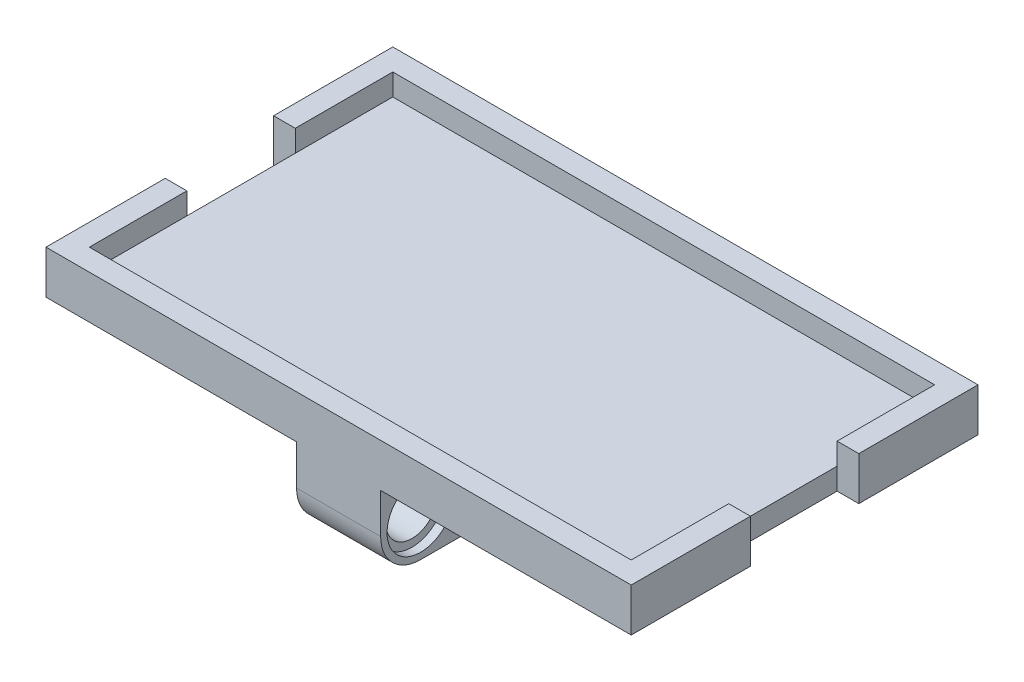
ISO-10303-21;
HEADER;
FILE_DESCRIPTION(('STEP AP214'),'2;1');
FILE_NAME('part.step','',(''),(''),'','','');
FILE_SCHEMA(('AUTOMOTIVE_DESIGN { 1 0 10303 214 1 1 1 1 }'));
ENDSEC;
DATA;
#1=APPLICATION_CONTEXT('core data for automotive mechanical design processes');
#2=APPLICATION_PROTOCOL_DEFINITION('international standard','automotive_design',2000,#1);
#3=PRODUCT_CONTEXT('',#1,'mechanical');
#4=PRODUCT('Part','Part','',(#3));
#5=PRODUCT_RELATED_PRODUCT_CATEGORY('part','',(#4));
#6=PRODUCT_DEFINITION_FORMATION('','',#4);
#7=PRODUCT_DEFINITION_CONTEXT('part definition',#1,'design');
#8=PRODUCT_DEFINITION('design','',#6,#7);
#9=PRODUCT_DEFINITION_SHAPE('','',#8);
#10=(LENGTH_UNIT() NAMED_UNIT(*) SI_UNIT(.MILLI.,.METRE.));
#11=(NAMED_UNIT(*) PLANE_ANGLE_UNIT() SI_UNIT($,.RADIAN.));
#12=(NAMED_UNIT(*) SI_UNIT($,.STERADIAN.) SOLID_ANGLE_UNIT());
#13=UNCERTAINTY_MEASURE_WITH_UNIT(LENGTH_MEASURE(1.E-05),#10,'distance_accuracy_value','');
#14=(GEOMETRIC_REPRESENTATION_CONTEXT(3) GLOBAL_UNCERTAINTY_ASSIGNED_CONTEXT((#13)) GLOBAL_UNIT_ASSIGNED_CONTEXT((#10,
#11,#12)) REPRESENTATION_CONTEXT('',''));
#15=CARTESIAN_POINT('',(0.,0.,0.));
#16=DIRECTION('',(0.,0.,1.));
#17=DIRECTION('',(1.,0.,0.));
#18=AXIS2_PLACEMENT_3D('',#15,#16,#17);
#19=CARTESIAN_POINT('',(23.09,-3.69,-19.63));
#20=DIRECTION('',(1.,0.,0.));
#21=DIRECTION('',(0.,0.,-1.));
#22=AXIS2_PLACEMENT_3D('',#19,#20,#21);
#23=CYLINDRICAL_SURFACE('',#22,2.4);
#24=CARTESIAN_POINT('',(23.92,-3.69,-19.63));
#25=DIRECTION('',(-1.,0.,0.));
#26=DIRECTION('',(0.,0.,1.));
#27=AXIS2_PLACEMENT_3D('',#24,#25,#26);
#28=CIRCLE('',#27,2.4);
#29=CARTESIAN_POINT('',(23.92,-3.69,-17.23));
#30=VERTEX_POINT('',#29);
#31=EDGE_CURVE('E219',#30,#30,#28,.F.);
#32=ORIENTED_EDGE('',*,*,#31,.F.);
#33=EDGE_LOOP('',(#32));
#34=FACE_BOUND('',#33,.T.);
#35=CARTESIAN_POINT('',(30.08,-3.69,-19.63));
#36=DIRECTION('',(1.,0.,0.));
#37=DIRECTION('',(0.,0.,-1.));
#38=AXIS2_PLACEMENT_3D('',#35,#36,#37);
#39=CIRCLE('',#38,2.4);
#40=CARTESIAN_POINT('',(30.08,-3.69,-22.03));
#41=VERTEX_POINT('',#40);
#42=EDGE_CURVE('E374',#41,#41,#39,.F.);
#43=ORIENTED_EDGE('',*,*,#42,.F.);
#44=EDGE_LOOP('',(#43));
#45=FACE_BOUND('',#44,.T.);
#46=ADVANCED_FACE('F35',(#34,#45),#23,.F.);
#47=CARTESIAN_POINT('',(23.09,-3.69,-11.66));
#48=DIRECTION('',(1.,0.,0.));
#49=DIRECTION('',(0.,0.,-1.));
#50=AXIS2_PLACEMENT_3D('',#47,#48,#49);
#51=CYLINDRICAL_SURFACE('',#50,2.4);
#52=CARTESIAN_POINT('',(23.92,-3.69,-11.66));
#53=DIRECTION('',(-1.,0.,0.));
#54=DIRECTION('',(0.,0.,1.));
#55=AXIS2_PLACEMENT_3D('',#52,#53,#54);
#56=CIRCLE('',#55,2.4);
#57=CARTESIAN_POINT('',(23.92,-3.69,-9.26));
#58=VERTEX_POINT('',#57);
#59=EDGE_CURVE('E361',#58,#58,#56,.F.);
#60=ORIENTED_EDGE('',*,*,#59,.F.);
#61=EDGE_LOOP('',(#60));
#62=FACE_BOUND('',#61,.T.);
#63=CARTESIAN_POINT('',(30.08,-3.69,-11.66));
#64=DIRECTION('',(1.,0.,0.));
#65=DIRECTION('',(0.,0.,-1.));
#66=AXIS2_PLACEMENT_3D('',#63,#64,#65);
#67=CIRCLE('',#66,2.4);
#68=CARTESIAN_POINT('',(30.08,-3.69,-14.06));
#69=VERTEX_POINT('',#68);
#70=EDGE_CURVE('E370',#69,#69,#67,.F.);
#71=ORIENTED_EDGE('',*,*,#70,.F.);
#72=EDGE_LOOP('',(#71));
#73=FACE_BOUND('',#72,.T.);
#74=ADVANCED_FACE('F413',(#62,#73),#51,.F.);
#75=CARTESIAN_POINT('',(23.09,-3.69,-3.69));
#76=DIRECTION('',(1.,0.,0.));
#77=DIRECTION('',(0.,0.,-1.));
#78=AXIS2_PLACEMENT_3D('',#75,#76,#77);
#79=CYLINDRICAL_SURFACE('',#78,2.4);
#80=CARTESIAN_POINT('',(23.92,-3.69,-3.69));
#81=DIRECTION('',(-1.,0.,0.));
#82=DIRECTION('',(0.,0.,1.));
#83=AXIS2_PLACEMENT_3D('',#80,#81,#82);
#84=CIRCLE('',#83,2.4);
#85=CARTESIAN_POINT('',(23.92,-3.69,-1.29));
#86=VERTEX_POINT('',#85);
#87=EDGE_CURVE('E358',#86,#86,#84,.F.);
#88=ORIENTED_EDGE('',*,*,#87,.F.);
#89=EDGE_LOOP('',(#88));
#90=FACE_BOUND('',#89,.T.);
#91=CARTESIAN_POINT('',(30.08,-3.69,-3.69));
#92=DIRECTION('',(1.,0.,0.));
#93=DIRECTION('',(0.,0.,-1.));
#94=AXIS2_PLACEMENT_3D('',#91,#92,#93);
#95=CIRCLE('',#94,2.4);
#96=CARTESIAN_POINT('',(30.08,-3.69,-6.09));
#97=VERTEX_POINT('',#96);
#98=EDGE_CURVE('E367',#97,#97,#95,.F.);
#99=ORIENTED_EDGE('',*,*,#98,.F.);
#100=EDGE_LOOP('',(#99));
#101=FACE_BOUND('',#100,.T.);
#102=ADVANCED_FACE('F420',(#90,#101),#79,.F.);
#103=CARTESIAN_POINT('',(0.,2.,0.));
#104=DIRECTION('',(1.,0.,0.));
#105=DIRECTION('',(0.,0.,-1.));
#106=AXIS2_PLACEMENT_3D('',#103,#104,#105);
#107=PLANE('',#106);
#108=DIRECTION('',(0.,0.,1.));
#109=VECTOR('',#108,1.);
#110=CARTESIAN_POINT('',(0.,0.,0.));
#111=LINE('',#110,#109);
#112=CARTESIAN_POINT('',(0.,0.,-32.));
#113=VERTEX_POINT('',#112);
#114=CARTESIAN_POINT('',(0.,0.,-21.));
#115=VERTEX_POINT('',#114);
#116=EDGE_CURVE('E333',#113,#115,#111,.T.);
#117=ORIENTED_EDGE('',*,*,#116,.T.);
#118=DIRECTION('',(0.,1.,0.));
#119=VECTOR('',#118,1.);
#120=CARTESIAN_POINT('',(0.,0.,-21.));
#121=LINE('',#120,#119);
#122=CARTESIAN_POINT('',(0.,4.,-21.));
#123=VERTEX_POINT('',#122);
#124=EDGE_CURVE('E244',#115,#123,#121,.T.);
#125=ORIENTED_EDGE('',*,*,#124,.T.);
#126=DIRECTION('',(0.,0.,1.));
#127=VECTOR('',#126,1.);
#128=CARTESIAN_POINT('',(0.,4.,0.));
#129=LINE('',#128,#127);
#130=CARTESIAN_POINT('',(0.,4.,-32.));
#131=VERTEX_POINT('',#130);
#132=EDGE_CURVE('E298',#131,#123,#129,.T.);
#133=ORIENTED_EDGE('',*,*,#132,.F.);
#134=DIRECTION('',(0.,-1.,0.));
#135=VECTOR('',#134,1.);
#136=CARTESIAN_POINT('',(0.,2.,-32.));
#137=LINE('',#136,#135);
#138=EDGE_CURVE('E345',#131,#113,#137,.T.);
#139=ORIENTED_EDGE('',*,*,#138,.T.);
#140=EDGE_LOOP('',(#117,#125,#133,#139));
#141=FACE_BOUND('',#140,.T.);
#142=ADVANCED_FACE('F504',(#141),#107,.F.);
#143=CARTESIAN_POINT('',(54.,2.,0.));
#144=DIRECTION('',(-1.,0.,0.));
#145=DIRECTION('',(0.,0.,1.));
#146=AXIS2_PLACEMENT_3D('',#143,#144,#145);
#147=PLANE('',#146);
#148=DIRECTION('',(0.,0.,-1.));
#149=VECTOR('',#148,1.);
#150=CARTESIAN_POINT('',(54.,0.,0.));
#151=LINE('',#150,#149);
#152=CARTESIAN_POINT('',(54.,0.,0.));
#153=VERTEX_POINT('',#152);
#154=CARTESIAN_POINT('',(54.,0.,-11.));
#155=VERTEX_POINT('',#154);
#156=EDGE_CURVE('E340',#153,#155,#151,.T.);
#157=ORIENTED_EDGE('',*,*,#156,.T.);
#158=DIRECTION('',(0.,1.,0.));
#159=VECTOR('',#158,1.);
#160=CARTESIAN_POINT('',(54.,0.,-11.));
#161=LINE('',#160,#159);
#162=CARTESIAN_POINT('',(54.,4.,-11.));
#163=VERTEX_POINT('',#162);
#164=EDGE_CURVE('E242',#155,#163,#161,.T.);
#165=ORIENTED_EDGE('',*,*,#164,.T.);
#166=DIRECTION('',(0.,0.,-1.));
#167=VECTOR('',#166,1.);
#168=CARTESIAN_POINT('',(54.,4.,0.));
#169=LINE('',#168,#167);
#170=CARTESIAN_POINT('',(54.,4.,0.));
#171=VERTEX_POINT('',#170);
#172=EDGE_CURVE('E305',#171,#163,#169,.T.);
#173=ORIENTED_EDGE('',*,*,#172,.F.);
#174=DIRECTION('',(0.,-1.,0.));
#175=VECTOR('',#174,1.);
#176=CARTESIAN_POINT('',(54.,2.,0.));
#177=LINE('',#176,#175);
#178=EDGE_CURVE('E351',#171,#153,#177,.T.);
#179=ORIENTED_EDGE('',*,*,#178,.T.);
#180=EDGE_LOOP('',(#157,#165,#173,#179));
#181=FACE_BOUND('',#180,.T.);
#182=ADVANCED_FACE('F498',(#181),#147,.F.);
#183=CARTESIAN_POINT('',(52.,4.,0.));
#184=DIRECTION('',(-1.,0.,0.));
#185=DIRECTION('',(0.,0.,1.));
#186=AXIS2_PLACEMENT_3D('',#183,#184,#185);
#187=PLANE('',#186);
#188=DIRECTION('',(0.,1.,0.));
#189=VECTOR('',#188,1.);
#190=CARTESIAN_POINT('',(52.,0.,-11.));
#191=LINE('',#190,#189);
#192=CARTESIAN_POINT('',(52.,2.,-11.));
#193=VERTEX_POINT('',#192);
#194=CARTESIAN_POINT('',(52.,4.,-11.));
#195=VERTEX_POINT('',#194);
#196=EDGE_CURVE('E274',#193,#195,#191,.T.);
#197=ORIENTED_EDGE('',*,*,#196,.F.);
#198=DIRECTION('',(0.,0.,-1.));
#199=VECTOR('',#198,1.);
#200=CARTESIAN_POINT('',(52.,2.,0.));
#201=LINE('',#200,#199);
#202=CARTESIAN_POINT('',(52.,2.,-2.));
#203=VERTEX_POINT('',#202);
#204=EDGE_CURVE('E312',#203,#193,#201,.T.);
#205=ORIENTED_EDGE('',*,*,#204,.F.);
#206=DIRECTION('',(0.,-1.,0.));
#207=VECTOR('',#206,1.);
#208=CARTESIAN_POINT('',(52.,4.,-2.));
#209=LINE('',#208,#207);
#210=CARTESIAN_POINT('',(52.,4.,-2.));
#211=VERTEX_POINT('',#210);
#212=EDGE_CURVE('E327',#211,#203,#209,.T.);
#213=ORIENTED_EDGE('',*,*,#212,.F.);
#214=DIRECTION('',(0.,0.,-1.));
#215=VECTOR('',#214,1.);
#216=CARTESIAN_POINT('',(52.,4.,0.));
#217=LINE('',#216,#215);
#218=EDGE_CURVE('E284',#211,#195,#217,.T.);
#219=ORIENTED_EDGE('',*,*,#218,.T.);
#220=EDGE_LOOP('',(#197,#205,#213,#219));
#221=FACE_BOUND('',#220,.T.);
#222=ADVANCED_FACE('F481',(#221),#187,.T.);
#223=CARTESIAN_POINT('',(2.,4.,0.));
#224=DIRECTION('',(1.,0.,0.));
#225=DIRECTION('',(0.,0.,-1.));
#226=AXIS2_PLACEMENT_3D('',#223,#224,#225);
#227=PLANE('',#226);
#228=DIRECTION('',(0.,1.,0.));
#229=VECTOR('',#228,1.);
#230=CARTESIAN_POINT('',(2.,0.,-21.));
#231=LINE('',#230,#229);
#232=CARTESIAN_POINT('',(2.,2.,-21.));
#233=VERTEX_POINT('',#232);
#234=CARTESIAN_POINT('',(2.,4.,-21.));
#235=VERTEX_POINT('',#234);
#236=EDGE_CURVE('E251',#233,#235,#231,.T.);
#237=ORIENTED_EDGE('',*,*,#236,.F.);
#238=DIRECTION('',(0.,0.,1.));
#239=VECTOR('',#238,1.);
#240=CARTESIAN_POINT('',(2.,2.,0.));
#241=LINE('',#240,#239);
#242=CARTESIAN_POINT('',(2.,2.,-30.));
#243=VERTEX_POINT('',#242);
#244=EDGE_CURVE('E283',#243,#233,#241,.T.);
#245=ORIENTED_EDGE('',*,*,#244,.F.);
#246=DIRECTION('',(0.,-1.,0.));
#247=VECTOR('',#246,1.);
#248=CARTESIAN_POINT('',(2.,4.,-30.));
#249=LINE('',#248,#247);
#250=CARTESIAN_POINT('',(2.,4.,-30.));
#251=VERTEX_POINT('',#250);
#252=EDGE_CURVE('E308',#251,#243,#249,.T.);
#253=ORIENTED_EDGE('',*,*,#252,.F.);
#254=DIRECTION('',(0.,0.,1.));
#255=VECTOR('',#254,1.);
#256=CARTESIAN_POINT('',(2.,4.,0.));
#257=LINE('',#256,#255);
#258=EDGE_CURVE('E291',#251,#235,#257,.T.);
#259=ORIENTED_EDGE('',*,*,#258,.T.);
#260=EDGE_LOOP('',(#237,#245,#253,#259));
#261=FACE_BOUND('',#260,.T.);
#262=ADVANCED_FACE('F472',(#261),#227,.T.);
#263=CARTESIAN_POINT('',(0.,4.,0.));
#264=DIRECTION('',(0.,1.,0.));
#265=DIRECTION('',(0.,0.,1.));
#266=AXIS2_PLACEMENT_3D('',#263,#264,#265);
#267=PLANE('',#266);
#268=DIRECTION('',(-1.,0.,0.));
#269=VECTOR('',#268,1.);
#270=CARTESIAN_POINT('',(0.,4.,-21.));
#271=LINE('',#270,#269);
#272=EDGE_CURVE('E233',#235,#123,#271,.T.);
#273=ORIENTED_EDGE('',*,*,#272,.F.);
#274=ORIENTED_EDGE('',*,*,#258,.F.);
#275=DIRECTION('',(-1.,0.,0.));
#276=VECTOR('',#275,1.);
#277=CARTESIAN_POINT('',(0.,4.,-30.));
#278=LINE('',#277,#276);
#279=CARTESIAN_POINT('',(52.,4.,-30.));
#280=VERTEX_POINT('',#279);
#281=EDGE_CURVE('E279',#280,#251,#278,.T.);
#282=ORIENTED_EDGE('',*,*,#281,.F.);
#283=CARTESIAN_POINT('',(52.,4.,-21.));
#284=VERTEX_POINT('',#283);
#285=EDGE_CURVE('E282',#284,#280,#217,.T.);
#286=ORIENTED_EDGE('',*,*,#285,.F.);
#287=DIRECTION('',(-1.,0.,0.));
#288=VECTOR('',#287,1.);
#289=CARTESIAN_POINT('',(54.,4.,-21.));
#290=LINE('',#289,#288);
#291=CARTESIAN_POINT('',(54.,4.,-21.));
#292=VERTEX_POINT('',#291);
#293=EDGE_CURVE('E228',#292,#284,#290,.T.);
#294=ORIENTED_EDGE('',*,*,#293,.F.);
#295=CARTESIAN_POINT('',(54.,4.,-32.));
#296=VERTEX_POINT('',#295);
#297=EDGE_CURVE('E304',#292,#296,#169,.T.);
#298=ORIENTED_EDGE('',*,*,#297,.T.);
#299=DIRECTION('',(-1.,0.,0.));
#300=VECTOR('',#299,1.);
#301=CARTESIAN_POINT('',(0.,4.,-32.));
#302=LINE('',#301,#300);
#303=EDGE_CURVE('E294',#296,#131,#302,.T.);
#304=ORIENTED_EDGE('',*,*,#303,.T.);
#305=ORIENTED_EDGE('',*,*,#132,.T.);
#306=EDGE_LOOP('',(#273,#274,#282,#286,#294,#298,#304,#305));
#307=FACE_BOUND('',#306,.T.);
#308=ADVANCED_FACE('F467',(#307),#267,.T.);
#309=CARTESIAN_POINT('',(0.,4.,-11.));
#310=VERTEX_POINT('',#309);
#311=CARTESIAN_POINT('',(0.,4.,0.));
#312=VERTEX_POINT('',#311);
#313=EDGE_CURVE('E297',#310,#312,#129,.T.);
#314=ORIENTED_EDGE('',*,*,#313,.F.);
#315=DIRECTION('',(0.,1.,0.));
#316=VECTOR('',#315,1.);
#317=CARTESIAN_POINT('',(0.,0.,-11.));
#318=LINE('',#317,#316);
#319=CARTESIAN_POINT('',(0.,0.,-11.));
#320=VERTEX_POINT('',#319);
#321=EDGE_CURVE('E239',#320,#310,#318,.T.);
#322=ORIENTED_EDGE('',*,*,#321,.F.);
#323=CARTESIAN_POINT('',(0.,0.,0.));
#324=VERTEX_POINT('',#323);
#325=EDGE_CURVE('E332',#320,#324,#111,.T.);
#326=ORIENTED_EDGE('',*,*,#325,.T.);
#327=DIRECTION('',(0.,-1.,0.));
#328=VECTOR('',#327,1.);
#329=CARTESIAN_POINT('',(0.,2.,0.));
#330=LINE('',#329,#328);
#331=EDGE_CURVE('E354',#312,#324,#330,.T.);
#332=ORIENTED_EDGE('',*,*,#331,.F.);
#333=EDGE_LOOP('',(#314,#322,#326,#332));
#334=FACE_BOUND('',#333,.T.);
#335=ADVANCED_FACE('F501',(#334),#107,.F.);
#336=CARTESIAN_POINT('',(0.,2.,0.));
#337=DIRECTION('',(0.,0.,-1.));
#338=DIRECTION('',(-1.,0.,0.));
#339=AXIS2_PLACEMENT_3D('',#336,#337,#338);
#340=PLANE('',#339);
#341=DIRECTION('',(0.,1.,0.));
#342=VECTOR('',#341,1.);
#343=CARTESIAN_POINT('',(23.12,-7.38,0.));
#344=LINE('',#343,#342);
#345=CARTESIAN_POINT('',(23.12,-3.69,0.));
#346=VERTEX_POINT('',#345);
#347=CARTESIAN_POINT('',(23.12,0.,0.));
#348=VERTEX_POINT('',#347);
#349=EDGE_CURVE('E223',#346,#348,#344,.T.);
#350=ORIENTED_EDGE('',*,*,#349,.F.);
#351=DIRECTION('',(-1.,0.,0.));
#352=VECTOR('',#351,1.);
#353=CARTESIAN_POINT('',(30.88,-3.69,0.));
#354=LINE('',#353,#352);
#355=CARTESIAN_POINT('',(30.88,-3.69,0.));
#356=VERTEX_POINT('',#355);
#357=EDGE_CURVE('E58',#346,#356,#354,.F.);
#358=ORIENTED_EDGE('',*,*,#357,.T.);
#359=DIRECTION('',(0.,1.,0.));
#360=VECTOR('',#359,1.);
#361=CARTESIAN_POINT('',(30.88,-7.38,0.));
#362=LINE('',#361,#360);
#363=CARTESIAN_POINT('',(30.88,0.,0.));
#364=VERTEX_POINT('',#363);
#365=EDGE_CURVE('E202',#356,#364,#362,.T.);
#366=ORIENTED_EDGE('',*,*,#365,.T.);
#367=DIRECTION('',(1.,0.,0.));
#368=VECTOR('',#367,1.);
#369=CARTESIAN_POINT('',(0.,0.,0.));
#370=LINE('',#369,#368);
#371=EDGE_CURVE('E212',#364,#153,#370,.T.);
#372=ORIENTED_EDGE('',*,*,#371,.T.);
#373=ORIENTED_EDGE('',*,*,#178,.F.);
#374=DIRECTION('',(1.,0.,0.));
#375=VECTOR('',#374,1.);
#376=CARTESIAN_POINT('',(0.,4.,0.));
#377=LINE('',#376,#375);
#378=EDGE_CURVE('E301',#312,#171,#377,.T.);
#379=ORIENTED_EDGE('',*,*,#378,.F.);
#380=ORIENTED_EDGE('',*,*,#331,.T.);
#381=EDGE_CURVE('E336',#324,#348,#370,.T.);
#382=ORIENTED_EDGE('',*,*,#381,.T.);
#383=EDGE_LOOP('',(#350,#358,#366,#372,#373,#379,#380,#382));
#384=FACE_BOUND('',#383,.T.);
#385=ADVANCED_FACE('F400',(#384),#340,.F.);
#386=ORIENTED_EDGE('',*,*,#297,.F.);
#387=DIRECTION('',(0.,1.,0.));
#388=VECTOR('',#387,1.);
#389=CARTESIAN_POINT('',(54.,0.,-21.));
#390=LINE('',#389,#388);
#391=CARTESIAN_POINT('',(54.,0.,-21.));
#392=VERTEX_POINT('',#391);
#393=EDGE_CURVE('E266',#392,#292,#390,.T.);
#394=ORIENTED_EDGE('',*,*,#393,.F.);
#395=CARTESIAN_POINT('',(54.,0.,-32.));
#396=VERTEX_POINT('',#395);
#397=EDGE_CURVE('E339',#392,#396,#151,.T.);
#398=ORIENTED_EDGE('',*,*,#397,.T.);
#399=DIRECTION('',(0.,-1.,0.));
#400=VECTOR('',#399,1.);
#401=CARTESIAN_POINT('',(54.,2.,-32.));
#402=LINE('',#401,#400);
#403=EDGE_CURVE('E348',#296,#396,#402,.T.);
#404=ORIENTED_EDGE('',*,*,#403,.F.);
#405=EDGE_LOOP('',(#386,#394,#398,#404));
#406=FACE_BOUND('',#405,.T.);
#407=ADVANCED_FACE('F493',(#406),#147,.F.);
#408=CARTESIAN_POINT('',(0.,2.,-32.));
#409=DIRECTION('',(0.,0.,1.));
#410=DIRECTION('',(1.,0.,0.));
#411=AXIS2_PLACEMENT_3D('',#408,#409,#410);
#412=PLANE('',#411);
#413=DIRECTION('',(-1.,0.,0.));
#414=VECTOR('',#413,1.);
#415=CARTESIAN_POINT('',(0.,0.,-32.));
#416=LINE('',#415,#414);
#417=EDGE_CURVE('E343',#396,#113,#416,.T.);
#418=ORIENTED_EDGE('',*,*,#417,.T.);
#419=ORIENTED_EDGE('',*,*,#138,.F.);
#420=ORIENTED_EDGE('',*,*,#303,.F.);
#421=ORIENTED_EDGE('',*,*,#403,.T.);
#422=EDGE_LOOP('',(#418,#419,#420,#421));
#423=FACE_BOUND('',#422,.T.);
#424=ADVANCED_FACE('F490',(#423),#412,.F.);
#425=CARTESIAN_POINT('',(0.,0.,0.));
#426=DIRECTION('',(0.,-1.,0.));
#427=DIRECTION('',(0.,0.,-1.));
#428=AXIS2_PLACEMENT_3D('',#425,#426,#427);
#429=PLANE('',#428);
#430=DIRECTION('',(0.,0.,-1.));
#431=VECTOR('',#430,1.);
#432=CARTESIAN_POINT('',(23.12,0.,0.));
#433=LINE('',#432,#431);
#434=CARTESIAN_POINT('',(23.12,0.,-23.32));
#435=VERTEX_POINT('',#434);
#436=EDGE_CURVE('E217',#348,#435,#433,.T.);
#437=ORIENTED_EDGE('',*,*,#436,.F.);
#438=ORIENTED_EDGE('',*,*,#381,.F.);
#439=ORIENTED_EDGE('',*,*,#325,.F.);
#440=DIRECTION('',(1.,0.,0.));
#441=VECTOR('',#440,1.);
#442=CARTESIAN_POINT('',(0.,0.,-11.));
#443=LINE('',#442,#441);
#444=CARTESIAN_POINT('',(2.,0.,-11.));
#445=VERTEX_POINT('',#444);
#446=EDGE_CURVE('E229',#320,#445,#443,.T.);
#447=ORIENTED_EDGE('',*,*,#446,.T.);
#448=DIRECTION('',(0.,0.,-1.));
#449=VECTOR('',#448,1.);
#450=CARTESIAN_POINT('',(2.,0.,-21.));
#451=LINE('',#450,#449);
#452=CARTESIAN_POINT('',(2.,0.,-21.));
#453=VERTEX_POINT('',#452);
#454=EDGE_CURVE('E232',#445,#453,#451,.T.);
#455=ORIENTED_EDGE('',*,*,#454,.T.);
#456=DIRECTION('',(-1.,0.,0.));
#457=VECTOR('',#456,1.);
#458=CARTESIAN_POINT('',(0.,0.,-21.));
#459=LINE('',#458,#457);
#460=EDGE_CURVE('E236',#453,#115,#459,.T.);
#461=ORIENTED_EDGE('',*,*,#460,.T.);
#462=ORIENTED_EDGE('',*,*,#116,.F.);
#463=ORIENTED_EDGE('',*,*,#417,.F.);
#464=ORIENTED_EDGE('',*,*,#397,.F.);
#465=DIRECTION('',(-1.,0.,0.));
#466=VECTOR('',#465,1.);
#467=CARTESIAN_POINT('',(54.,0.,-21.));
#468=LINE('',#467,#466);
#469=CARTESIAN_POINT('',(52.,0.,-21.));
#470=VERTEX_POINT('',#469);
#471=EDGE_CURVE('E256',#392,#470,#468,.T.);
#472=ORIENTED_EDGE('',*,*,#471,.T.);
#473=DIRECTION('',(0.,0.,1.));
#474=VECTOR('',#473,1.);
#475=CARTESIAN_POINT('',(52.,0.,-21.));
#476=LINE('',#475,#474);
#477=CARTESIAN_POINT('',(52.,0.,-11.));
#478=VERTEX_POINT('',#477);
#479=EDGE_CURVE('E259',#470,#478,#476,.T.);
#480=ORIENTED_EDGE('',*,*,#479,.T.);
#481=DIRECTION('',(1.,0.,0.));
#482=VECTOR('',#481,1.);
#483=CARTESIAN_POINT('',(54.,0.,-11.));
#484=LINE('',#483,#482);
#485=EDGE_CURVE('E263',#478,#155,#484,.T.);
#486=ORIENTED_EDGE('',*,*,#485,.T.);
#487=ORIENTED_EDGE('',*,*,#156,.F.);
#488=ORIENTED_EDGE('',*,*,#371,.F.);
#489=DIRECTION('',(0.,0.,1.));
#490=VECTOR('',#489,1.);
#491=CARTESIAN_POINT('',(30.88,0.,0.));
#492=LINE('',#491,#490);
#493=CARTESIAN_POINT('',(30.88,0.,-23.32));
#494=VERTEX_POINT('',#493);
#495=EDGE_CURVE('E197',#494,#364,#492,.T.);
#496=ORIENTED_EDGE('',*,*,#495,.F.);
#497=DIRECTION('',(1.,0.,0.));
#498=VECTOR('',#497,1.);
#499=CARTESIAN_POINT('',(23.12,0.,-23.32));
#500=LINE('',#499,#498);
#501=EDGE_CURVE('E209',#435,#494,#500,.T.);
#502=ORIENTED_EDGE('',*,*,#501,.F.);
#503=EDGE_LOOP('',(#437,#438,#439,#447,#455,#461,#462,#463,#464,#472,#480,#486,#487,#488,#496,#502));
#504=FACE_BOUND('',#503,.T.);
#505=ADVANCED_FACE('F208',(#504),#429,.T.);
#506=CARTESIAN_POINT('',(0.,4.,-30.));
#507=DIRECTION('',(0.,0.,1.));
#508=DIRECTION('',(1.,0.,0.));
#509=AXIS2_PLACEMENT_3D('',#506,#507,#508);
#510=PLANE('',#509);
#511=DIRECTION('',(-1.,0.,0.));
#512=VECTOR('',#511,1.);
#513=CARTESIAN_POINT('',(0.,2.,-30.));
#514=LINE('',#513,#512);
#515=CARTESIAN_POINT('',(52.,2.,-30.));
#516=VERTEX_POINT('',#515);
#517=EDGE_CURVE('E247',#516,#243,#514,.T.);
#518=ORIENTED_EDGE('',*,*,#517,.F.);
#519=DIRECTION('',(0.,-1.,0.));
#520=VECTOR('',#519,1.);
#521=CARTESIAN_POINT('',(52.,4.,-30.));
#522=LINE('',#521,#520);
#523=EDGE_CURVE('E329',#280,#516,#522,.T.);
#524=ORIENTED_EDGE('',*,*,#523,.F.);
#525=ORIENTED_EDGE('',*,*,#281,.T.);
#526=ORIENTED_EDGE('',*,*,#252,.T.);
#527=EDGE_LOOP('',(#518,#524,#525,#526));
#528=FACE_BOUND('',#527,.T.);
#529=ADVANCED_FACE('F479',(#528),#510,.T.);
#530=DIRECTION('',(0.,1.,0.));
#531=VECTOR('',#530,1.);
#532=CARTESIAN_POINT('',(52.,0.,-21.));
#533=LINE('',#532,#531);
#534=CARTESIAN_POINT('',(52.,2.,-21.));
#535=VERTEX_POINT('',#534);
#536=EDGE_CURVE('E277',#535,#284,#533,.T.);
#537=ORIENTED_EDGE('',*,*,#536,.T.);
#538=ORIENTED_EDGE('',*,*,#285,.T.);
#539=ORIENTED_EDGE('',*,*,#523,.T.);
#540=EDGE_CURVE('E311',#535,#516,#201,.T.);
#541=ORIENTED_EDGE('',*,*,#540,.F.);
#542=EDGE_LOOP('',(#537,#538,#539,#541));
#543=FACE_BOUND('',#542,.T.);
#544=ADVANCED_FACE('F475',(#543),#187,.T.);
#545=CARTESIAN_POINT('',(0.,4.,-2.));
#546=DIRECTION('',(0.,0.,-1.));
#547=DIRECTION('',(-1.,0.,0.));
#548=AXIS2_PLACEMENT_3D('',#545,#546,#547);
#549=PLANE('',#548);
#550=DIRECTION('',(1.,0.,0.));
#551=VECTOR('',#550,1.);
#552=CARTESIAN_POINT('',(0.,2.,-2.));
#553=LINE('',#552,#551);
#554=CARTESIAN_POINT('',(2.,2.,-2.));
#555=VERTEX_POINT('',#554);
#556=EDGE_CURVE('E315',#555,#203,#553,.T.);
#557=ORIENTED_EDGE('',*,*,#556,.F.);
#558=DIRECTION('',(0.,-1.,0.));
#559=VECTOR('',#558,1.);
#560=CARTESIAN_POINT('',(2.,4.,-2.));
#561=LINE('',#560,#559);
#562=CARTESIAN_POINT('',(2.,4.,-2.));
#563=VERTEX_POINT('',#562);
#564=EDGE_CURVE('E324',#563,#555,#561,.T.);
#565=ORIENTED_EDGE('',*,*,#564,.F.);
#566=DIRECTION('',(1.,0.,0.));
#567=VECTOR('',#566,1.);
#568=CARTESIAN_POINT('',(0.,4.,-2.));
#569=LINE('',#568,#567);
#570=EDGE_CURVE('E287',#563,#211,#569,.T.);
#571=ORIENTED_EDGE('',*,*,#570,.T.);
#572=ORIENTED_EDGE('',*,*,#212,.T.);
#573=EDGE_LOOP('',(#557,#565,#571,#572));
#574=FACE_BOUND('',#573,.T.);
#575=ADVANCED_FACE('F470',(#574),#549,.T.);
#576=DIRECTION('',(0.,1.,0.));
#577=VECTOR('',#576,1.);
#578=CARTESIAN_POINT('',(2.,0.,-11.));
#579=LINE('',#578,#577);
#580=CARTESIAN_POINT('',(2.,2.,-11.));
#581=VERTEX_POINT('',#580);
#582=CARTESIAN_POINT('',(2.,4.,-11.));
#583=VERTEX_POINT('',#582);
#584=EDGE_CURVE('E254',#581,#583,#579,.T.);
#585=ORIENTED_EDGE('',*,*,#584,.T.);
#586=EDGE_CURVE('E290',#583,#563,#257,.T.);
#587=ORIENTED_EDGE('',*,*,#586,.T.);
#588=ORIENTED_EDGE('',*,*,#564,.T.);
#589=EDGE_CURVE('E319',#581,#555,#241,.T.);
#590=ORIENTED_EDGE('',*,*,#589,.F.);
#591=EDGE_LOOP('',(#585,#587,#588,#590));
#592=FACE_BOUND('',#591,.T.);
#593=ADVANCED_FACE('F465',(#592),#227,.T.);
#594=DIRECTION('',(1.,0.,0.));
#595=VECTOR('',#594,1.);
#596=CARTESIAN_POINT('',(0.,4.,-11.));
#597=LINE('',#596,#595);
#598=EDGE_CURVE('E240',#310,#583,#597,.T.);
#599=ORIENTED_EDGE('',*,*,#598,.F.);
#600=ORIENTED_EDGE('',*,*,#313,.T.);
#601=ORIENTED_EDGE('',*,*,#378,.T.);
#602=ORIENTED_EDGE('',*,*,#172,.T.);
#603=DIRECTION('',(1.,0.,0.));
#604=VECTOR('',#603,1.);
#605=CARTESIAN_POINT('',(54.,4.,-11.));
#606=LINE('',#605,#604);
#607=EDGE_CURVE('E260',#195,#163,#606,.T.);
#608=ORIENTED_EDGE('',*,*,#607,.F.);
#609=ORIENTED_EDGE('',*,*,#218,.F.);
#610=ORIENTED_EDGE('',*,*,#570,.F.);
#611=ORIENTED_EDGE('',*,*,#586,.F.);
#612=EDGE_LOOP('',(#599,#600,#601,#602,#608,#609,#610,#611));
#613=FACE_BOUND('',#612,.T.);
#614=ADVANCED_FACE('F462',(#613),#267,.T.);
#615=CARTESIAN_POINT('',(0.,2.,0.));
#616=DIRECTION('',(0.,-1.,0.));
#617=DIRECTION('',(0.,0.,-1.));
#618=AXIS2_PLACEMENT_3D('',#615,#616,#617);
#619=PLANE('',#618);
#620=ORIENTED_EDGE('',*,*,#204,.T.);
#621=EDGE_CURVE('E316',#193,#535,#201,.T.);
#622=ORIENTED_EDGE('',*,*,#621,.T.);
#623=ORIENTED_EDGE('',*,*,#540,.T.);
#624=ORIENTED_EDGE('',*,*,#517,.T.);
#625=ORIENTED_EDGE('',*,*,#244,.T.);
#626=EDGE_CURVE('E322',#233,#581,#241,.T.);
#627=ORIENTED_EDGE('',*,*,#626,.T.);
#628=ORIENTED_EDGE('',*,*,#589,.T.);
#629=ORIENTED_EDGE('',*,*,#556,.T.);
#630=EDGE_LOOP('',(#620,#622,#623,#624,#625,#627,#628,#629));
#631=FACE_BOUND('',#630,.T.);
#632=ADVANCED_FACE('F457',(#631),#619,.F.);
#633=CARTESIAN_POINT('',(52.,0.,-21.));
#634=DIRECTION('',(-1.,0.,0.));
#635=DIRECTION('',(0.,0.,1.));
#636=AXIS2_PLACEMENT_3D('',#633,#634,#635);
#637=PLANE('',#636);
#638=EDGE_CURVE('E271',#478,#193,#191,.T.);
#639=ORIENTED_EDGE('',*,*,#638,.F.);
#640=ORIENTED_EDGE('',*,*,#479,.F.);
#641=EDGE_CURVE('E275',#470,#535,#533,.T.);
#642=ORIENTED_EDGE('',*,*,#641,.T.);
#643=ORIENTED_EDGE('',*,*,#621,.F.);
#644=EDGE_LOOP('',(#639,#640,#642,#643));
#645=FACE_BOUND('',#644,.T.);
#646=ADVANCED_FACE('F453',(#645),#637,.F.);
#647=CARTESIAN_POINT('',(54.,0.,-11.));
#648=DIRECTION('',(0.,0.,1.));
#649=DIRECTION('',(1.,0.,0.));
#650=AXIS2_PLACEMENT_3D('',#647,#648,#649);
#651=PLANE('',#650);
#652=ORIENTED_EDGE('',*,*,#607,.T.);
#653=ORIENTED_EDGE('',*,*,#164,.F.);
#654=ORIENTED_EDGE('',*,*,#485,.F.);
#655=ORIENTED_EDGE('',*,*,#638,.T.);
#656=ORIENTED_EDGE('',*,*,#196,.T.);
#657=EDGE_LOOP('',(#652,#653,#654,#655,#656));
#658=FACE_BOUND('',#657,.T.);
#659=ADVANCED_FACE('F450',(#658),#651,.F.);
#660=CARTESIAN_POINT('',(54.,0.,-21.));
#661=DIRECTION('',(0.,0.,-1.));
#662=DIRECTION('',(-1.,0.,0.));
#663=AXIS2_PLACEMENT_3D('',#660,#661,#662);
#664=PLANE('',#663);
#665=ORIENTED_EDGE('',*,*,#293,.T.);
#666=ORIENTED_EDGE('',*,*,#536,.F.);
#667=ORIENTED_EDGE('',*,*,#641,.F.);
#668=ORIENTED_EDGE('',*,*,#471,.F.);
#669=ORIENTED_EDGE('',*,*,#393,.T.);
#670=EDGE_LOOP('',(#665,#666,#667,#668,#669));
#671=FACE_BOUND('',#670,.T.);
#672=ADVANCED_FACE('F446',(#671),#664,.F.);
#673=CARTESIAN_POINT('',(2.,0.,-21.));
#674=DIRECTION('',(1.,0.,0.));
#675=DIRECTION('',(0.,0.,-1.));
#676=AXIS2_PLACEMENT_3D('',#673,#674,#675);
#677=PLANE('',#676);
#678=EDGE_CURVE('E248',#453,#233,#231,.T.);
#679=ORIENTED_EDGE('',*,*,#678,.F.);
#680=ORIENTED_EDGE('',*,*,#454,.F.);
#681=EDGE_CURVE('E252',#445,#581,#579,.T.);
#682=ORIENTED_EDGE('',*,*,#681,.T.);
#683=ORIENTED_EDGE('',*,*,#626,.F.);
#684=EDGE_LOOP('',(#679,#680,#682,#683));
#685=FACE_BOUND('',#684,.T.);
#686=ADVANCED_FACE('F442',(#685),#677,.F.);
#687=CARTESIAN_POINT('',(0.,0.,-21.));
#688=DIRECTION('',(0.,0.,-1.));
#689=DIRECTION('',(-1.,0.,0.));
#690=AXIS2_PLACEMENT_3D('',#687,#688,#689);
#691=PLANE('',#690);
#692=ORIENTED_EDGE('',*,*,#272,.T.);
#693=ORIENTED_EDGE('',*,*,#124,.F.);
#694=ORIENTED_EDGE('',*,*,#460,.F.);
#695=ORIENTED_EDGE('',*,*,#678,.T.);
#696=ORIENTED_EDGE('',*,*,#236,.T.);
#697=EDGE_LOOP('',(#692,#693,#694,#695,#696));
#698=FACE_BOUND('',#697,.T.);
#699=ADVANCED_FACE('F439',(#698),#691,.F.);
#700=CARTESIAN_POINT('',(0.,0.,-11.));
#701=DIRECTION('',(0.,0.,1.));
#702=DIRECTION('',(1.,0.,0.));
#703=AXIS2_PLACEMENT_3D('',#700,#701,#702);
#704=PLANE('',#703);
#705=ORIENTED_EDGE('',*,*,#598,.T.);
#706=ORIENTED_EDGE('',*,*,#584,.F.);
#707=ORIENTED_EDGE('',*,*,#681,.F.);
#708=ORIENTED_EDGE('',*,*,#446,.F.);
#709=ORIENTED_EDGE('',*,*,#321,.T.);
#710=EDGE_LOOP('',(#705,#706,#707,#708,#709));
#711=FACE_BOUND('',#710,.T.);
#712=ADVANCED_FACE('F437',(#711),#704,.F.);
#713=CARTESIAN_POINT('',(23.12,-7.38,0.));
#714=DIRECTION('',(1.,0.,0.));
#715=DIRECTION('',(0.,0.,-1.));
#716=AXIS2_PLACEMENT_3D('',#713,#714,#715);
#717=PLANE('',#716);
#718=CARTESIAN_POINT('',(23.12,-3.69,-19.63));
#719=DIRECTION('',(-1.,0.,0.));
#720=DIRECTION('',(0.,0.,1.));
#721=AXIS2_PLACEMENT_3D('',#718,#719,#720);
#722=CIRCLE('',#721,3.1);
#723=CARTESIAN_POINT('',(23.12,-3.69,-16.53));
#724=VERTEX_POINT('',#723);
#725=EDGE_CURVE('E377',#724,#724,#722,.T.);
#726=ORIENTED_EDGE('',*,*,#725,.F.);
#727=EDGE_LOOP('',(#726));
#728=FACE_BOUND('',#727,.T.);
#729=CARTESIAN_POINT('',(23.12,-3.69,-3.69));
#730=DIRECTION('',(-1.,0.,0.));
#731=DIRECTION('',(0.,0.,1.));
#732=AXIS2_PLACEMENT_3D('',#729,#730,#731);
#733=CIRCLE('',#732,3.1);
#734=CARTESIAN_POINT('',(23.12,-3.69,-0.590000000000002));
#735=VERTEX_POINT('',#734);
#736=EDGE_CURVE('E939',#735,#735,#733,.T.);
#737=ORIENTED_EDGE('',*,*,#736,.F.);
#738=EDGE_LOOP('',(#737));
#739=FACE_BOUND('',#738,.T.);
#740=CARTESIAN_POINT('',(23.12,-3.69,-11.66));
#741=DIRECTION('',(-1.,0.,0.));
#742=DIRECTION('',(0.,0.,1.));
#743=AXIS2_PLACEMENT_3D('',#740,#741,#742);
#744=CIRCLE('',#743,3.1);
#745=CARTESIAN_POINT('',(23.12,-3.69,-8.56));
#746=VERTEX_POINT('',#745);
#747=EDGE_CURVE('E938',#746,#746,#744,.T.);
#748=ORIENTED_EDGE('',*,*,#747,.F.);
#749=EDGE_LOOP('',(#748));
#750=FACE_BOUND('',#749,.T.);
#751=DIRECTION('',(0.,0.,-1.));
#752=VECTOR('',#751,1.);
#753=CARTESIAN_POINT('',(23.12,-7.38,0.));
#754=LINE('',#753,#752);
#755=CARTESIAN_POINT('',(23.12,-7.38,-3.69));
#756=VERTEX_POINT('',#755);
#757=CARTESIAN_POINT('',(23.12,-7.38,-19.63));
#758=VERTEX_POINT('',#757);
#759=EDGE_CURVE('E213',#756,#758,#754,.T.);
#760=ORIENTED_EDGE('',*,*,#759,.F.);
#761=CARTESIAN_POINT('',(23.12,-3.69,-3.69));
#762=DIRECTION('',(1.,0.,0.));
#763=DIRECTION('',(0.,0.,-1.));
#764=AXIS2_PLACEMENT_3D('',#761,#762,#763);
#765=CIRCLE('',#764,3.69);
#766=EDGE_CURVE('E385',#756,#346,#765,.F.);
#767=ORIENTED_EDGE('',*,*,#766,.T.);
#768=ORIENTED_EDGE('',*,*,#349,.T.);
#769=ORIENTED_EDGE('',*,*,#436,.T.);
#770=DIRECTION('',(0.,1.,0.));
#771=VECTOR('',#770,1.);
#772=CARTESIAN_POINT('',(23.12,-7.38,-23.32));
#773=LINE('',#772,#771);
#774=CARTESIAN_POINT('',(23.12,-3.69,-23.32));
#775=VERTEX_POINT('',#774);
#776=EDGE_CURVE('E201',#775,#435,#773,.T.);
#777=ORIENTED_EDGE('',*,*,#776,.F.);
#778=CARTESIAN_POINT('',(23.12,-3.69,-19.63));
#779=DIRECTION('',(1.,0.,0.));
#780=DIRECTION('',(0.,0.,-1.));
#781=AXIS2_PLACEMENT_3D('',#778,#779,#780);
#782=CIRCLE('',#781,3.69);
#783=EDGE_CURVE('E383',#775,#758,#782,.F.);
#784=ORIENTED_EDGE('',*,*,#783,.T.);
#785=EDGE_LOOP('',(#760,#767,#768,#769,#777,#784));
#786=FACE_BOUND('',#785,.T.);
#787=ADVANCED_FACE('F399',(#728,#739,#750,#786),#717,.F.);
#788=CARTESIAN_POINT('',(23.12,-7.38,-23.32));
#789=DIRECTION('',(0.,0.,1.));
#790=DIRECTION('',(1.,0.,0.));
#791=AXIS2_PLACEMENT_3D('',#788,#789,#790);
#792=PLANE('',#791);
#793=DIRECTION('',(0.,1.,0.));
#794=VECTOR('',#793,1.);
#795=CARTESIAN_POINT('',(30.88,-7.38,-23.32));
#796=LINE('',#795,#794);
#797=CARTESIAN_POINT('',(30.88,-3.69,-23.32));
#798=VERTEX_POINT('',#797);
#799=EDGE_CURVE('E194',#798,#494,#796,.T.);
#800=ORIENTED_EDGE('',*,*,#799,.F.);
#801=DIRECTION('',(1.,0.,0.));
#802=VECTOR('',#801,1.);
#803=CARTESIAN_POINT('',(23.12,-3.69,-23.32));
#804=LINE('',#803,#802);
#805=EDGE_CURVE('E11',#798,#775,#804,.F.);
#806=ORIENTED_EDGE('',*,*,#805,.T.);
#807=ORIENTED_EDGE('',*,*,#776,.T.);
#808=ORIENTED_EDGE('',*,*,#501,.T.);
#809=EDGE_LOOP('',(#800,#806,#807,#808));
#810=FACE_BOUND('',#809,.T.);
#811=ADVANCED_FACE('F215',(#810),#792,.F.);
#812=CARTESIAN_POINT('',(30.88,-7.38,0.));
#813=DIRECTION('',(-1.,0.,0.));
#814=DIRECTION('',(0.,0.,1.));
#815=AXIS2_PLACEMENT_3D('',#812,#813,#814);
#816=PLANE('',#815);
#817=CARTESIAN_POINT('',(30.88,-3.69,-3.69));
#818=DIRECTION('',(1.,0.,0.));
#819=DIRECTION('',(0.,0.,-1.));
#820=AXIS2_PLACEMENT_3D('',#817,#818,#819);
#821=CIRCLE('',#820,3.1);
#822=CARTESIAN_POINT('',(30.88,-3.69,-6.79));
#823=VERTEX_POINT('',#822);
#824=EDGE_CURVE('E919',#823,#823,#821,.T.);
#825=ORIENTED_EDGE('',*,*,#824,.F.);
#826=EDGE_LOOP('',(#825));
#827=FACE_BOUND('',#826,.T.);
#828=CARTESIAN_POINT('',(30.88,-3.69,-11.66));
#829=DIRECTION('',(1.,0.,0.));
#830=DIRECTION('',(0.,0.,-1.));
#831=AXIS2_PLACEMENT_3D('',#828,#829,#830);
#832=CIRCLE('',#831,3.1);
#833=CARTESIAN_POINT('',(30.88,-3.69,-14.76));
#834=VERTEX_POINT('',#833);
#835=EDGE_CURVE('E924',#834,#834,#832,.T.);
#836=ORIENTED_EDGE('',*,*,#835,.F.);
#837=EDGE_LOOP('',(#836));
#838=FACE_BOUND('',#837,.T.);
#839=CARTESIAN_POINT('',(30.88,-3.69,-19.63));
#840=DIRECTION('',(1.,0.,0.));
#841=DIRECTION('',(0.,0.,-1.));
#842=AXIS2_PLACEMENT_3D('',#839,#840,#841);
#843=CIRCLE('',#842,3.1);
#844=CARTESIAN_POINT('',(30.88,-3.69,-22.73));
#845=VERTEX_POINT('',#844);
#846=EDGE_CURVE('E932',#845,#845,#843,.T.);
#847=ORIENTED_EDGE('',*,*,#846,.F.);
#848=EDGE_LOOP('',(#847));
#849=FACE_BOUND('',#848,.T.);
#850=ORIENTED_EDGE('',*,*,#365,.F.);
#851=CARTESIAN_POINT('',(30.88,-3.69,-3.69));
#852=DIRECTION('',(-1.,0.,0.));
#853=DIRECTION('',(0.,0.,1.));
#854=AXIS2_PLACEMENT_3D('',#851,#852,#853);
#855=CIRCLE('',#854,3.69);
#856=CARTESIAN_POINT('',(30.88,-7.38,-3.69));
#857=VERTEX_POINT('',#856);
#858=EDGE_CURVE('E43',#356,#857,#855,.F.);
#859=ORIENTED_EDGE('',*,*,#858,.T.);
#860=DIRECTION('',(0.,0.,1.));
#861=VECTOR('',#860,1.);
#862=CARTESIAN_POINT('',(30.88,-7.38,0.));
#863=LINE('',#862,#861);
#864=CARTESIAN_POINT('',(30.88,-7.38,-19.63));
#865=VERTEX_POINT('',#864);
#866=EDGE_CURVE('E225',#865,#857,#863,.T.);
#867=ORIENTED_EDGE('',*,*,#866,.F.);
#868=CARTESIAN_POINT('',(30.88,-3.69,-19.63));
#869=DIRECTION('',(-1.,0.,0.));
#870=DIRECTION('',(0.,0.,1.));
#871=AXIS2_PLACEMENT_3D('',#868,#869,#870);
#872=CIRCLE('',#871,3.69);
#873=EDGE_CURVE('E50',#865,#798,#872,.F.);
#874=ORIENTED_EDGE('',*,*,#873,.T.);
#875=ORIENTED_EDGE('',*,*,#799,.T.);
#876=ORIENTED_EDGE('',*,*,#495,.T.);
#877=EDGE_LOOP('',(#850,#859,#867,#874,#875,#876));
#878=FACE_BOUND('',#877,.T.);
#879=ADVANCED_FACE('F196',(#827,#838,#849,#878),#816,.F.);
#880=CARTESIAN_POINT('',(0.,-7.38,0.));
#881=DIRECTION('',(0.,-1.,0.));
#882=DIRECTION('',(0.,0.,-1.));
#883=AXIS2_PLACEMENT_3D('',#880,#881,#882);
#884=PLANE('',#883);
#885=ORIENTED_EDGE('',*,*,#866,.T.);
#886=DIRECTION('',(-1.,0.,0.));
#887=VECTOR('',#886,1.);
#888=CARTESIAN_POINT('',(23.12,-7.38,-3.69));
#889=LINE('',#888,#887);
#890=EDGE_CURVE('E380',#857,#756,#889,.T.);
#891=ORIENTED_EDGE('',*,*,#890,.T.);
#892=ORIENTED_EDGE('',*,*,#759,.T.);
#893=DIRECTION('',(1.,0.,0.));
#894=VECTOR('',#893,1.);
#895=CARTESIAN_POINT('',(30.88,-7.38,-19.63));
#896=LINE('',#895,#894);
#897=EDGE_CURVE('E357',#758,#865,#896,.T.);
#898=ORIENTED_EDGE('',*,*,#897,.T.);
#899=EDGE_LOOP('',(#885,#891,#892,#898));
#900=FACE_BOUND('',#899,.T.);
#901=ADVANCED_FACE('F393',(#900),#884,.T.);
#902=CARTESIAN_POINT('',(23.92,-3.69,-3.69));
#903=DIRECTION('',(-1.,0.,0.));
#904=DIRECTION('',(0.,0.,1.));
#905=AXIS2_PLACEMENT_3D('',#902,#903,#904);
#906=PLANE('',#905);
#907=CARTESIAN_POINT('',(23.92,-3.69,-3.69));
#908=DIRECTION('',(-1.,0.,0.));
#909=DIRECTION('',(0.,0.,1.));
#910=AXIS2_PLACEMENT_3D('',#907,#908,#909);
#911=CIRCLE('',#910,3.1);
#912=CARTESIAN_POINT('',(23.92,-3.69,-0.590000000000002));
#913=VERTEX_POINT('',#912);
#914=EDGE_CURVE('E935',#913,#913,#911,.T.);
#915=ORIENTED_EDGE('',*,*,#914,.T.);
#916=EDGE_LOOP('',(#915));
#917=FACE_BOUND('',#916,.T.);
#918=ORIENTED_EDGE('',*,*,#87,.T.);
#919=EDGE_LOOP('',(#918));
#920=FACE_BOUND('',#919,.T.);
#921=ADVANCED_FACE('F429',(#917,#920),#906,.T.);
#922=CARTESIAN_POINT('',(23.92,-3.69,-3.69));
#923=DIRECTION('',(-1.,0.,0.));
#924=DIRECTION('',(0.,0.,1.));
#925=AXIS2_PLACEMENT_3D('',#922,#923,#924);
#926=CYLINDRICAL_SURFACE('',#925,3.1);
#927=ORIENTED_EDGE('',*,*,#914,.F.);
#928=EDGE_LOOP('',(#927));
#929=FACE_BOUND('',#928,.T.);
#930=ORIENTED_EDGE('',*,*,#736,.T.);
#931=EDGE_LOOP('',(#930));
#932=FACE_BOUND('',#931,.T.);
#933=ADVANCED_FACE('F661',(#929,#932),#926,.F.);
#934=CARTESIAN_POINT('',(23.92,-3.69,-11.66));
#935=DIRECTION('',(-1.,0.,0.));
#936=DIRECTION('',(0.,0.,1.));
#937=AXIS2_PLACEMENT_3D('',#934,#935,#936);
#938=PLANE('',#937);
#939=CARTESIAN_POINT('',(23.92,-3.69,-11.66));
#940=DIRECTION('',(-1.,0.,0.));
#941=DIRECTION('',(0.,0.,1.));
#942=AXIS2_PLACEMENT_3D('',#939,#940,#941);
#943=CIRCLE('',#942,3.1);
#944=CARTESIAN_POINT('',(23.92,-3.69,-8.56));
#945=VERTEX_POINT('',#944);
#946=EDGE_CURVE('E362',#945,#945,#943,.T.);
#947=ORIENTED_EDGE('',*,*,#946,.T.);
#948=EDGE_LOOP('',(#947));
#949=FACE_BOUND('',#948,.T.);
#950=ORIENTED_EDGE('',*,*,#59,.T.);
#951=EDGE_LOOP('',(#950));
#952=FACE_BOUND('',#951,.T.);
#953=ADVANCED_FACE('F672',(#949,#952),#938,.T.);
#954=CARTESIAN_POINT('',(23.92,-3.69,-11.66));
#955=DIRECTION('',(-1.,0.,0.));
#956=DIRECTION('',(0.,0.,1.));
#957=AXIS2_PLACEMENT_3D('',#954,#955,#956);
#958=CYLINDRICAL_SURFACE('',#957,3.1);
#959=ORIENTED_EDGE('',*,*,#946,.F.);
#960=EDGE_LOOP('',(#959));
#961=FACE_BOUND('',#960,.T.);
#962=ORIENTED_EDGE('',*,*,#747,.T.);
#963=EDGE_LOOP('',(#962));
#964=FACE_BOUND('',#963,.T.);
#965=ADVANCED_FACE('F682',(#961,#964),#958,.F.);
#966=CARTESIAN_POINT('',(23.92,-3.69,-19.63));
#967=DIRECTION('',(-1.,0.,0.));
#968=DIRECTION('',(0.,0.,1.));
#969=AXIS2_PLACEMENT_3D('',#966,#967,#968);
#970=PLANE('',#969);
#971=CARTESIAN_POINT('',(23.92,-3.69,-19.63));
#972=DIRECTION('',(-1.,0.,0.));
#973=DIRECTION('',(0.,0.,1.));
#974=AXIS2_PLACEMENT_3D('',#971,#972,#973);
#975=CIRCLE('',#974,3.1);
#976=CARTESIAN_POINT('',(23.92,-3.69,-16.53));
#977=VERTEX_POINT('',#976);
#978=EDGE_CURVE('E942',#977,#977,#975,.T.);
#979=ORIENTED_EDGE('',*,*,#978,.T.);
#980=EDGE_LOOP('',(#979));
#981=FACE_BOUND('',#980,.T.);
#982=ORIENTED_EDGE('',*,*,#31,.T.);
#983=EDGE_LOOP('',(#982));
#984=FACE_BOUND('',#983,.T.);
#985=ADVANCED_FACE('F692',(#981,#984),#970,.T.);
#986=CARTESIAN_POINT('',(23.92,-3.69,-19.63));
#987=DIRECTION('',(-1.,0.,0.));
#988=DIRECTION('',(0.,0.,1.));
#989=AXIS2_PLACEMENT_3D('',#986,#987,#988);
#990=CYLINDRICAL_SURFACE('',#989,3.1);
#991=ORIENTED_EDGE('',*,*,#978,.F.);
#992=EDGE_LOOP('',(#991));
#993=FACE_BOUND('',#992,.T.);
#994=ORIENTED_EDGE('',*,*,#725,.T.);
#995=EDGE_LOOP('',(#994));
#996=FACE_BOUND('',#995,.T.);
#997=ADVANCED_FACE('F702',(#993,#996),#990,.F.);
#998=CARTESIAN_POINT('',(30.08,-3.69,-19.63));
#999=DIRECTION('',(1.,0.,0.));
#1000=DIRECTION('',(0.,0.,-1.));
#1001=AXIS2_PLACEMENT_3D('',#998,#999,#1000);
#1002=PLANE('',#1001);
#1003=CARTESIAN_POINT('',(30.08,-3.69,-19.63));
#1004=DIRECTION('',(1.,0.,0.));
#1005=DIRECTION('',(0.,0.,-1.));
#1006=AXIS2_PLACEMENT_3D('',#1003,#1004,#1005);
#1007=CIRCLE('',#1006,3.1);
#1008=CARTESIAN_POINT('',(30.08,-3.69,-22.73));
#1009=VERTEX_POINT('',#1008);
#1010=EDGE_CURVE('E929',#1009,#1009,#1007,.T.);
#1011=ORIENTED_EDGE('',*,*,#1010,.T.);
#1012=EDGE_LOOP('',(#1011));
#1013=FACE_BOUND('',#1012,.T.);
#1014=ORIENTED_EDGE('',*,*,#42,.T.);
#1015=EDGE_LOOP('',(#1014));
#1016=FACE_BOUND('',#1015,.T.);
#1017=ADVANCED_FACE('F711',(#1013,#1016),#1002,.T.);
#1018=CARTESIAN_POINT('',(30.08,-3.69,-19.63));
#1019=DIRECTION('',(1.,0.,0.));
#1020=DIRECTION('',(0.,0.,-1.));
#1021=AXIS2_PLACEMENT_3D('',#1018,#1019,#1020);
#1022=CYLINDRICAL_SURFACE('',#1021,3.1);
#1023=ORIENTED_EDGE('',*,*,#1010,.F.);
#1024=EDGE_LOOP('',(#1023));
#1025=FACE_BOUND('',#1024,.T.);
#1026=ORIENTED_EDGE('',*,*,#846,.T.);
#1027=EDGE_LOOP('',(#1026));
#1028=FACE_BOUND('',#1027,.T.);
#1029=ADVANCED_FACE('F738',(#1025,#1028),#1022,.F.);
#1030=CARTESIAN_POINT('',(30.08,-3.69,-11.66));
#1031=DIRECTION('',(1.,0.,0.));
#1032=DIRECTION('',(0.,0.,-1.));
#1033=AXIS2_PLACEMENT_3D('',#1030,#1031,#1032);
#1034=PLANE('',#1033);
#1035=CARTESIAN_POINT('',(30.08,-3.69,-11.66));
#1036=DIRECTION('',(1.,0.,0.));
#1037=DIRECTION('',(0.,0.,-1.));
#1038=AXIS2_PLACEMENT_3D('',#1035,#1036,#1037);
#1039=CIRCLE('',#1038,3.1);
#1040=CARTESIAN_POINT('',(30.08,-3.69,-14.76));
#1041=VERTEX_POINT('',#1040);
#1042=EDGE_CURVE('E920',#1041,#1041,#1039,.T.);
#1043=ORIENTED_EDGE('',*,*,#1042,.T.);
#1044=EDGE_LOOP('',(#1043));
#1045=FACE_BOUND('',#1044,.T.);
#1046=ORIENTED_EDGE('',*,*,#70,.T.);
#1047=EDGE_LOOP('',(#1046));
#1048=FACE_BOUND('',#1047,.T.);
#1049=ADVANCED_FACE('F748',(#1045,#1048),#1034,.T.);
#1050=CARTESIAN_POINT('',(30.08,-3.69,-11.66));
#1051=DIRECTION('',(1.,0.,0.));
#1052=DIRECTION('',(0.,0.,-1.));
#1053=AXIS2_PLACEMENT_3D('',#1050,#1051,#1052);
#1054=CYLINDRICAL_SURFACE('',#1053,3.1);
#1055=ORIENTED_EDGE('',*,*,#1042,.F.);
#1056=EDGE_LOOP('',(#1055));
#1057=FACE_BOUND('',#1056,.T.);
#1058=ORIENTED_EDGE('',*,*,#835,.T.);
#1059=EDGE_LOOP('',(#1058));
#1060=FACE_BOUND('',#1059,.T.);
#1061=ADVANCED_FACE('F758',(#1057,#1060),#1054,.F.);
#1062=CARTESIAN_POINT('',(30.08,-3.69,-3.69));
#1063=DIRECTION('',(1.,0.,0.));
#1064=DIRECTION('',(0.,0.,-1.));
#1065=AXIS2_PLACEMENT_3D('',#1062,#1063,#1064);
#1066=PLANE('',#1065);
#1067=CARTESIAN_POINT('',(30.08,-3.69,-3.69));
#1068=DIRECTION('',(1.,0.,0.));
#1069=DIRECTION('',(0.,0.,-1.));
#1070=AXIS2_PLACEMENT_3D('',#1067,#1068,#1069);
#1071=CIRCLE('',#1070,3.1);
#1072=CARTESIAN_POINT('',(30.08,-3.69,-6.79));
#1073=VERTEX_POINT('',#1072);
#1074=EDGE_CURVE('E371',#1073,#1073,#1071,.T.);
#1075=ORIENTED_EDGE('',*,*,#1074,.T.);
#1076=EDGE_LOOP('',(#1075));
#1077=FACE_BOUND('',#1076,.T.);
#1078=ORIENTED_EDGE('',*,*,#98,.T.);
#1079=EDGE_LOOP('',(#1078));
#1080=FACE_BOUND('',#1079,.T.);
#1081=ADVANCED_FACE('F768',(#1077,#1080),#1066,.T.);
#1082=CARTESIAN_POINT('',(30.08,-3.69,-3.69));
#1083=DIRECTION('',(1.,0.,0.));
#1084=DIRECTION('',(0.,0.,-1.));
#1085=AXIS2_PLACEMENT_3D('',#1082,#1083,#1084);
#1086=CYLINDRICAL_SURFACE('',#1085,3.1);
#1087=ORIENTED_EDGE('',*,*,#1074,.F.);
#1088=EDGE_LOOP('',(#1087));
#1089=FACE_BOUND('',#1088,.T.);
#1090=ORIENTED_EDGE('',*,*,#824,.T.);
#1091=EDGE_LOOP('',(#1090));
#1092=FACE_BOUND('',#1091,.T.);
#1093=ADVANCED_FACE('F411',(#1089,#1092),#1086,.F.);
#1094=CARTESIAN_POINT('',(0.,-3.69,-3.69));
#1095=DIRECTION('',(1.,0.,0.));
#1096=DIRECTION('',(0.,0.,-1.));
#1097=AXIS2_PLACEMENT_3D('',#1094,#1095,#1096);
#1098=CYLINDRICAL_SURFACE('',#1097,3.69);
#1099=ORIENTED_EDGE('',*,*,#858,.F.);
#1100=ORIENTED_EDGE('',*,*,#357,.F.);
#1101=ORIENTED_EDGE('',*,*,#766,.F.);
#1102=ORIENTED_EDGE('',*,*,#890,.F.);
#1103=EDGE_LOOP('',(#1099,#1100,#1101,#1102));
#1104=FACE_BOUND('',#1103,.T.);
#1105=ADVANCED_FACE('F397',(#1104),#1098,.T.);
#1106=CARTESIAN_POINT('',(0.,-3.69,-19.63));
#1107=DIRECTION('',(-1.,0.,0.));
#1108=DIRECTION('',(0.,0.,1.));
#1109=AXIS2_PLACEMENT_3D('',#1106,#1107,#1108);
#1110=CYLINDRICAL_SURFACE('',#1109,3.69);
#1111=ORIENTED_EDGE('',*,*,#783,.F.);
#1112=ORIENTED_EDGE('',*,*,#805,.F.);
#1113=ORIENTED_EDGE('',*,*,#873,.F.);
#1114=ORIENTED_EDGE('',*,*,#897,.F.);
#1115=EDGE_LOOP('',(#1111,#1112,#1113,#1114));
#1116=FACE_BOUND('',#1115,.T.);
#1117=ADVANCED_FACE('F37',(#1116),#1110,.T.);
#1118=CLOSED_SHELL('',(#46,#74,#102,#142,#182,#222,#262,#308,#335,#385,#407,#424,#505,#529,#544,
#575,#593,#614,#632,#646,#659,#672,#686,#699,#712,#787,#811,#879,#901,#921,#933,#953,#965,#985,
#997,#1017,#1029,#1049,#1061,#1081,#1093,#1105,#1117));
#1119=MANIFOLD_SOLID_BREP('B2',#1118);
#1120=ADVANCED_BREP_SHAPE_REPRESENTATION('',(#18,#1119),#14);
#1121=SHAPE_DEFINITION_REPRESENTATION(#9,#1120);
ENDSEC;
END-ISO-10303-21;
